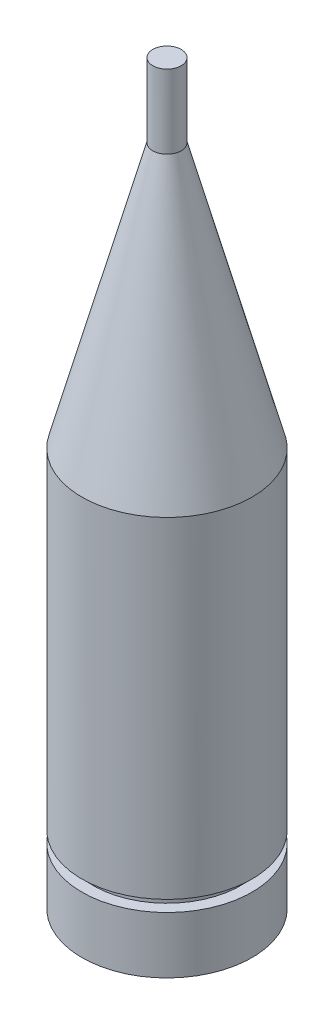
ISO-10303-21;
HEADER;
FILE_DESCRIPTION(('STEP AP214'),'2;1');
FILE_NAME('part.step','',(''),(''),'','','');
FILE_SCHEMA(('AUTOMOTIVE_DESIGN { 1 0 10303 214 1 1 1 1 }'));
ENDSEC;
DATA;
#1=APPLICATION_CONTEXT('core data for automotive mechanical design processes');
#2=APPLICATION_PROTOCOL_DEFINITION('international standard','automotive_design',2000,#1);
#3=PRODUCT_CONTEXT('',#1,'mechanical');
#4=PRODUCT('Part','Part','',(#3));
#5=PRODUCT_RELATED_PRODUCT_CATEGORY('part','',(#4));
#6=PRODUCT_DEFINITION_FORMATION('','',#4);
#7=PRODUCT_DEFINITION_CONTEXT('part definition',#1,'design');
#8=PRODUCT_DEFINITION('design','',#6,#7);
#9=PRODUCT_DEFINITION_SHAPE('','',#8);
#10=(LENGTH_UNIT() NAMED_UNIT(*) SI_UNIT(.MILLI.,.METRE.));
#11=(NAMED_UNIT(*) PLANE_ANGLE_UNIT() SI_UNIT($,.RADIAN.));
#12=(NAMED_UNIT(*) SI_UNIT($,.STERADIAN.) SOLID_ANGLE_UNIT());
#13=UNCERTAINTY_MEASURE_WITH_UNIT(LENGTH_MEASURE(1.E-05),#10,'distance_accuracy_value','');
#14=(GEOMETRIC_REPRESENTATION_CONTEXT(3) GLOBAL_UNCERTAINTY_ASSIGNED_CONTEXT((#13)) GLOBAL_UNIT_ASSIGNED_CONTEXT((#10,
#11,#12)) REPRESENTATION_CONTEXT('',''));
#15=CARTESIAN_POINT('',(0.,0.,0.));
#16=DIRECTION('',(0.,0.,1.));
#17=DIRECTION('',(1.,0.,0.));
#18=AXIS2_PLACEMENT_3D('',#15,#16,#17);
#19=CARTESIAN_POINT('',(2.5,130.,0.));
#20=DIRECTION('',(0.,-1.,0.));
#21=DIRECTION('',(1.,0.,0.));
#22=AXIS2_PLACEMENT_3D('',#19,#20,#21);
#23=PLANE('',#22);
#24=CARTESIAN_POINT('',(0.,130.,0.));
#25=DIRECTION('',(0.,1.,0.));
#26=DIRECTION('',(-1.,0.,0.));
#27=AXIS2_PLACEMENT_3D('',#24,#25,#26);
#28=CIRCLE('',#27,2.5);
#29=CARTESIAN_POINT('',(-2.5,130.,0.));
#30=VERTEX_POINT('',#29);
#31=EDGE_CURVE('E59',#30,#30,#28,.T.);
#32=ORIENTED_EDGE('',*,*,#31,.T.);
#33=EDGE_LOOP('',(#32));
#34=FACE_BOUND('',#33,.T.);
#35=ADVANCED_FACE('F31',(#34),#23,.F.);
#36=CARTESIAN_POINT('',(0.,0.,0.));
#37=DIRECTION('',(0.,1.,0.));
#38=DIRECTION('',(-1.,0.,0.));
#39=AXIS2_PLACEMENT_3D('',#36,#37,#38);
#40=PLANE('',#39);
#41=CARTESIAN_POINT('',(0.,0.,0.));
#42=DIRECTION('',(0.,1.,0.));
#43=DIRECTION('',(-1.,0.,0.));
#44=AXIS2_PLACEMENT_3D('',#41,#42,#43);
#45=CIRCLE('',#44,15.);
#46=CARTESIAN_POINT('',(-15.,0.,0.));
#47=VERTEX_POINT('',#46);
#48=EDGE_CURVE('E10',#47,#47,#45,.T.);
#49=ORIENTED_EDGE('',*,*,#48,.F.);
#50=EDGE_LOOP('',(#49));
#51=FACE_BOUND('',#50,.T.);
#52=ADVANCED_FACE('F101',(#51),#40,.F.);
#53=CARTESIAN_POINT('',(0.,130.,0.));
#54=DIRECTION('',(0.,1.,0.));
#55=DIRECTION('',(-1.,0.,0.));
#56=AXIS2_PLACEMENT_3D('',#53,#54,#55);
#57=CYLINDRICAL_SURFACE('',#56,15.);
#58=CARTESIAN_POINT('',(0.,10.,0.));
#59=DIRECTION('',(0.,1.,0.));
#60=DIRECTION('',(-1.,0.,0.));
#61=AXIS2_PLACEMENT_3D('',#58,#59,#60);
#62=CIRCLE('',#61,15.);
#63=CARTESIAN_POINT('',(-15.,10.,0.));
#64=VERTEX_POINT('',#63);
#65=EDGE_CURVE('E37',#64,#64,#62,.T.);
#66=ORIENTED_EDGE('',*,*,#65,.F.);
#67=EDGE_LOOP('',(#66));
#68=FACE_BOUND('',#67,.T.);
#69=ORIENTED_EDGE('',*,*,#48,.T.);
#70=EDGE_LOOP('',(#69));
#71=FACE_BOUND('',#70,.T.);
#72=ADVANCED_FACE('F96',(#68,#71),#57,.T.);
#73=CARTESIAN_POINT('',(15.,10.,0.));
#74=DIRECTION('',(0.,-1.,0.));
#75=DIRECTION('',(1.,0.,0.));
#76=AXIS2_PLACEMENT_3D('',#73,#74,#75);
#77=PLANE('',#76);
#78=CARTESIAN_POINT('',(0.,10.,0.));
#79=DIRECTION('',(0.,1.,0.));
#80=DIRECTION('',(-1.,0.,0.));
#81=AXIS2_PLACEMENT_3D('',#78,#79,#80);
#82=CIRCLE('',#81,13.);
#83=CARTESIAN_POINT('',(-13.,10.,0.));
#84=VERTEX_POINT('',#83);
#85=EDGE_CURVE('E41',#84,#84,#82,.T.);
#86=ORIENTED_EDGE('',*,*,#85,.F.);
#87=EDGE_LOOP('',(#86));
#88=FACE_BOUND('',#87,.T.);
#89=ORIENTED_EDGE('',*,*,#65,.T.);
#90=EDGE_LOOP('',(#89));
#91=FACE_BOUND('',#90,.T.);
#92=ADVANCED_FACE('F91',(#88,#91),#77,.F.);
#93=CARTESIAN_POINT('',(0.,130.,0.));
#94=DIRECTION('',(0.,1.,0.));
#95=DIRECTION('',(-1.,0.,0.));
#96=AXIS2_PLACEMENT_3D('',#93,#94,#95);
#97=CYLINDRICAL_SURFACE('',#96,13.);
#98=CARTESIAN_POINT('',(0.,12.,0.));
#99=DIRECTION('',(0.,1.,0.));
#100=DIRECTION('',(-1.,0.,0.));
#101=AXIS2_PLACEMENT_3D('',#98,#99,#100);
#102=CIRCLE('',#101,13.);
#103=CARTESIAN_POINT('',(-13.,12.,0.));
#104=VERTEX_POINT('',#103);
#105=EDGE_CURVE('E45',#104,#104,#102,.T.);
#106=ORIENTED_EDGE('',*,*,#105,.F.);
#107=EDGE_LOOP('',(#106));
#108=FACE_BOUND('',#107,.T.);
#109=ORIENTED_EDGE('',*,*,#85,.T.);
#110=EDGE_LOOP('',(#109));
#111=FACE_BOUND('',#110,.T.);
#112=ADVANCED_FACE('F85',(#108,#111),#97,.T.);
#113=CARTESIAN_POINT('',(13.,12.,0.));
#114=DIRECTION('',(0.,1.,0.));
#115=DIRECTION('',(-1.,0.,0.));
#116=AXIS2_PLACEMENT_3D('',#113,#114,#115);
#117=PLANE('',#116);
#118=CARTESIAN_POINT('',(0.,12.,0.));
#119=DIRECTION('',(0.,1.,0.));
#120=DIRECTION('',(-1.,0.,0.));
#121=AXIS2_PLACEMENT_3D('',#118,#119,#120);
#122=CIRCLE('',#121,15.);
#123=CARTESIAN_POINT('',(-15.,12.,0.));
#124=VERTEX_POINT('',#123);
#125=EDGE_CURVE('E50',#124,#124,#122,.T.);
#126=ORIENTED_EDGE('',*,*,#125,.F.);
#127=EDGE_LOOP('',(#126));
#128=FACE_BOUND('',#127,.T.);
#129=ORIENTED_EDGE('',*,*,#105,.T.);
#130=EDGE_LOOP('',(#129));
#131=FACE_BOUND('',#130,.T.);
#132=ADVANCED_FACE('F79',(#128,#131),#117,.F.);
#133=CARTESIAN_POINT('',(0.,130.,0.));
#134=DIRECTION('',(0.,1.,0.));
#135=DIRECTION('',(-1.,0.,0.));
#136=AXIS2_PLACEMENT_3D('',#133,#134,#135);
#137=CYLINDRICAL_SURFACE('',#136,15.);
#138=CARTESIAN_POINT('',(0.,70.3493649053891,0.));
#139=DIRECTION('',(0.,1.,0.));
#140=DIRECTION('',(-1.,0.,0.));
#141=AXIS2_PLACEMENT_3D('',#138,#139,#140);
#142=CIRCLE('',#141,15.);
#143=CARTESIAN_POINT('',(15.,70.3493649053891,0.));
#144=VERTEX_POINT('',#143);
#145=EDGE_CURVE('E53',#144,#144,#142,.T.);
#146=ORIENTED_EDGE('',*,*,#145,.F.);
#147=EDGE_LOOP('',(#146));
#148=FACE_BOUND('',#147,.T.);
#149=ORIENTED_EDGE('',*,*,#125,.T.);
#150=EDGE_LOOP('',(#149));
#151=FACE_BOUND('',#150,.T.);
#152=ADVANCED_FACE('F73',(#148,#151),#137,.T.);
#153=CARTESIAN_POINT('',(0.,70.3493649053891,0.));
#154=DIRECTION('',(0.,-1.,0.));
#155=DIRECTION('',(1.,0.,0.));
#156=AXIS2_PLACEMENT_3D('',#153,#154,#155);
#157=CONICAL_SURFACE('',#156,15.,0.26179938779915);
#158=CARTESIAN_POINT('',(0.,117.,0.));
#159=DIRECTION('',(0.,1.,0.));
#160=DIRECTION('',(-1.,0.,0.));
#161=AXIS2_PLACEMENT_3D('',#158,#159,#160);
#162=CIRCLE('',#161,2.5);
#163=CARTESIAN_POINT('',(2.5,117.,0.));
#164=VERTEX_POINT('',#163);
#165=EDGE_CURVE('E56',#164,#164,#162,.T.);
#166=CARTESIAN_POINT('',(2.5,117.,0.));
#167=CARTESIAN_POINT('',(2.63020833333333,116.514055884431,0.));
#168=CARTESIAN_POINT('',(2.76041666666667,116.028111768862,0.));
#169=CARTESIAN_POINT('',(3.02083333333334,115.056223537725,0.));
#170=CARTESIAN_POINT('',(3.15104166666667,114.570279422156,0.));
#171=CARTESIAN_POINT('',(3.41145833333334,113.598391191018,0.));
#172=CARTESIAN_POINT('',(3.54166666666667,113.112447075449,0.));
#173=CARTESIAN_POINT('',(3.80208333333334,112.140558844311,0.));
#174=CARTESIAN_POINT('',(3.93229166666667,111.654614728743,0.));
#175=CARTESIAN_POINT('',(4.19270833333334,110.682726497605,0.));
#176=CARTESIAN_POINT('',(4.32291666666667,110.196782382036,0.));
#177=CARTESIAN_POINT('',(4.58333333333334,109.224894150898,0.));
#178=CARTESIAN_POINT('',(4.71354166666667,108.738950035329,0.));
#179=CARTESIAN_POINT('',(4.97395833333334,107.767061804192,0.));
#180=CARTESIAN_POINT('',(5.10416666666667,107.281117688623,0.));
#181=CARTESIAN_POINT('',(5.36458333333334,106.309229457485,0.));
#182=CARTESIAN_POINT('',(5.49479166666668,105.823285341916,0.));
#183=CARTESIAN_POINT('',(5.75520833333334,104.851397110778,0.));
#184=CARTESIAN_POINT('',(5.88541666666667,104.36545299521,0.));
#185=CARTESIAN_POINT('',(6.14583333333334,103.393564764072,0.));
#186=CARTESIAN_POINT('',(6.27604166666668,102.907620648503,0.));
#187=CARTESIAN_POINT('',(6.53645833333335,101.935732417365,0.));
#188=CARTESIAN_POINT('',(6.66666666666668,101.449788301796,0.));
#189=CARTESIAN_POINT('',(6.92708333333335,100.477900070659,0.));
#190=CARTESIAN_POINT('',(7.05729166666668,99.9919559550898,0.));
#191=CARTESIAN_POINT('',(7.31770833333335,99.020067723952,0.));
#192=CARTESIAN_POINT('',(7.44791666666668,98.5341236083832,0.));
#193=CARTESIAN_POINT('',(7.70833333333335,97.5622353772455,0.));
#194=CARTESIAN_POINT('',(7.83854166666668,97.0762912616766,0.));
#195=CARTESIAN_POINT('',(8.09895833333335,96.1044030305389,0.));
#196=CARTESIAN_POINT('',(8.22916666666668,95.61845891497,0.));
#197=CARTESIAN_POINT('',(8.48958333333335,94.6465706838323,0.));
#198=CARTESIAN_POINT('',(8.61979166666668,94.1606265682634,0.));
#199=CARTESIAN_POINT('',(8.88020833333335,93.1887383371257,0.));
#200=CARTESIAN_POINT('',(9.01041666666668,92.7027942215568,0.));
#201=CARTESIAN_POINT('',(9.27083333333335,91.7309059904191,0.));
#202=CARTESIAN_POINT('',(9.40104166666669,91.2449618748502,0.));
#203=CARTESIAN_POINT('',(9.66145833333335,90.2730736437125,0.));
#204=CARTESIAN_POINT('',(9.79166666666668,89.7871295281436,0.));
#205=CARTESIAN_POINT('',(10.0520833333334,88.8152412970059,0.));
#206=CARTESIAN_POINT('',(10.1822916666667,88.329297181437,0.));
#207=CARTESIAN_POINT('',(10.4427083333334,87.3574089502993,0.));
#208=CARTESIAN_POINT('',(10.5729166666667,86.8714648347304,0.));
#209=CARTESIAN_POINT('',(10.8333333333334,85.8995766035927,0.));
#210=CARTESIAN_POINT('',(10.9635416666667,85.4136324880239,0.));
#211=CARTESIAN_POINT('',(11.2239583333334,84.4417442568861,0.));
#212=CARTESIAN_POINT('',(11.3541666666667,83.9558001413173,0.));
#213=CARTESIAN_POINT('',(11.6145833333334,82.9839119101795,0.));
#214=CARTESIAN_POINT('',(11.7447916666667,82.4979677946107,0.));
#215=CARTESIAN_POINT('',(12.0052083333334,81.5260795634729,0.));
#216=CARTESIAN_POINT('',(12.1354166666667,81.0401354479041,0.));
#217=CARTESIAN_POINT('',(12.3958333333334,80.0682472167664,0.));
#218=CARTESIAN_POINT('',(12.5260416666667,79.5823031011975,0.));
#219=CARTESIAN_POINT('',(12.7864583333334,78.6104148700598,0.));
#220=CARTESIAN_POINT('',(12.9166666666667,78.1244707544909,0.));
#221=CARTESIAN_POINT('',(13.1770833333334,77.1525825233532,0.));
#222=CARTESIAN_POINT('',(13.3072916666667,76.6666384077843,0.));
#223=CARTESIAN_POINT('',(13.5677083333334,75.6947501766466,0.));
#224=CARTESIAN_POINT('',(13.6979166666667,75.2088060610777,0.));
#225=CARTESIAN_POINT('',(13.9583333333334,74.23691782994,0.));
#226=CARTESIAN_POINT('',(14.0885416666667,73.7509737143711,0.));
#227=CARTESIAN_POINT('',(14.3489583333334,72.7790854832334,0.));
#228=CARTESIAN_POINT('',(14.4791666666667,72.2931413676645,0.));
#229=CARTESIAN_POINT('',(14.7395833333334,71.3212531365268,0.));
#230=CARTESIAN_POINT('',(14.8697916666667,70.8353090209579,0.));
#231=CARTESIAN_POINT('',(15.,70.3493649053891,0.));
#232=B_SPLINE_CURVE_WITH_KNOTS('',3,(#166,#167,#168,#169,#170,#171,#172,#173,#174,#175,#176,
#177,#178,#179,#180,#181,#182,#183,#184,#185,#186,#187,#188,#189,#190,#191,#192,#193,#194,#195,
#196,#197,#198,#199,#200,#201,#202,#203,#204,#205,#206,#207,#208,#209,#210,#211,#212,#213,#214,
#215,#216,#217,#218,#219,#220,#221,#222,#223,#224,#225,#226,#227,#228,#229,#230,#231),
.UNSPECIFIED.,.F.,.F.,(4,2,2,2,2,2,2,2,2,2,2,2,2,2,2,2,2,2,2,2,2,2,2,2,2,2,2,2,2,2,2,2,4),(0.,
1.50925910357666,3.01851820715334,4.52777731073,6.03703641430667,7.54629551788334,
9.05555462146002,10.5648137250367,12.0740728286133,13.58333193219,15.0925910357667,
16.6018501393434,18.11110924292,19.6203683464967,21.1296274500734,22.63888655365,
24.1481456572267,25.6574047608034,27.16666386438,28.6759229679567,30.1851820715334,
31.69444117511,33.2037002786867,34.7129593822634,36.22221848584,37.7314775894167,
39.2407366929934,40.74999579657,42.2592549001467,43.7685140037234,45.2777731073,
46.7870322108767,48.2962913144534),.UNSPECIFIED.);
#233=EDGE_CURVE('BSEAM67',#164,#144,#232,.T.);
#234=ORIENTED_EDGE('',*,*,#165,.F.);
#235=ORIENTED_EDGE('',*,*,#145,.T.);
#236=ORIENTED_EDGE('',*,*,#233,.T.);
#237=ORIENTED_EDGE('',*,*,#233,.F.);
#238=EDGE_LOOP('',(#234,#236,#235,#237));
#239=FACE_BOUND('',#238,.T.);
#240=ADVANCED_FACE('F67',(#239),#157,.T.);
#241=CARTESIAN_POINT('',(0.,130.,0.));
#242=DIRECTION('',(0.,1.,0.));
#243=DIRECTION('',(-1.,0.,0.));
#244=AXIS2_PLACEMENT_3D('',#241,#242,#243);
#245=CYLINDRICAL_SURFACE('',#244,2.5);
#246=ORIENTED_EDGE('',*,*,#31,.F.);
#247=EDGE_LOOP('',(#246));
#248=FACE_BOUND('',#247,.T.);
#249=ORIENTED_EDGE('',*,*,#165,.T.);
#250=EDGE_LOOP('',(#249));
#251=FACE_BOUND('',#250,.T.);
#252=ADVANCED_FACE('F64',(#248,#251),#245,.T.);
#253=CLOSED_SHELL('',(#35,#52,#72,#92,#112,#132,#152,#240,#252));
#254=MANIFOLD_SOLID_BREP('B2',#253);
#255=ADVANCED_BREP_SHAPE_REPRESENTATION('',(#18,#254),#14);
#256=SHAPE_DEFINITION_REPRESENTATION(#9,#255);
ENDSEC;
END-ISO-10303-21;
